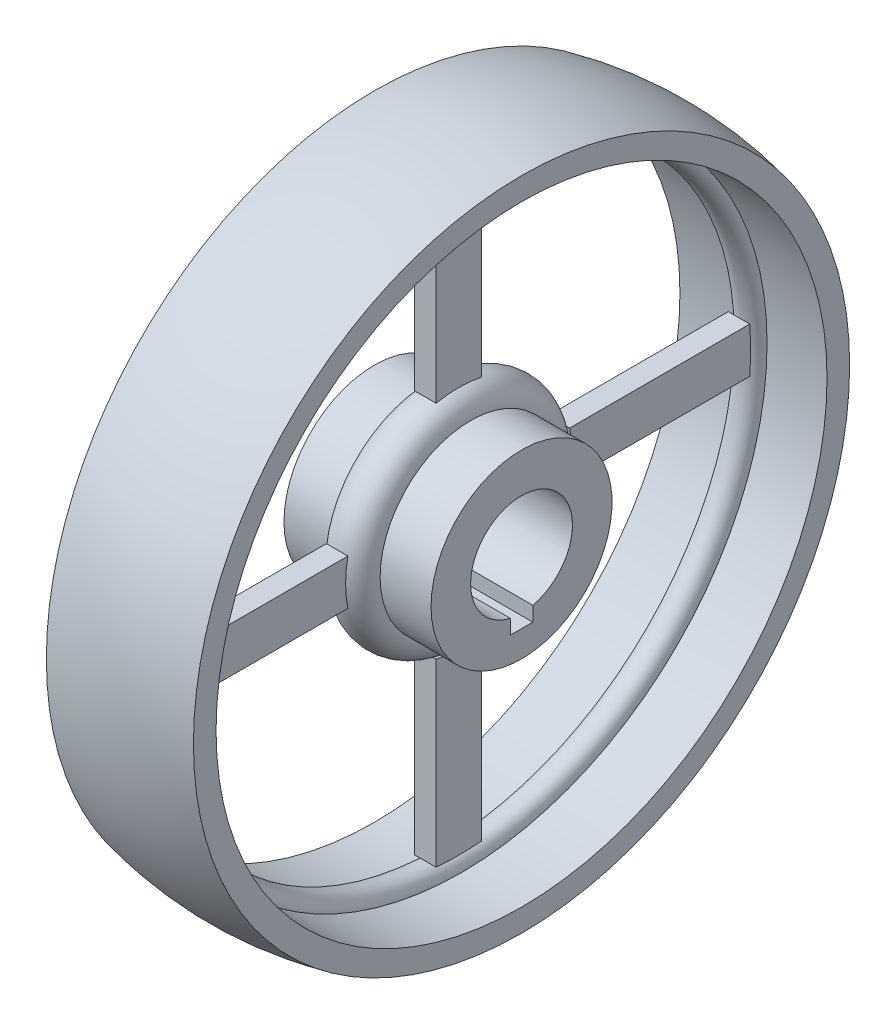
ISO-10303-21;
HEADER;
FILE_DESCRIPTION(('STEP AP214'),'2;1');
FILE_NAME('part.step','',(''),(''),'','','');
FILE_SCHEMA(('AUTOMOTIVE_DESIGN { 1 0 10303 214 1 1 1 1 }'));
ENDSEC;
DATA;
#1=APPLICATION_CONTEXT('core data for automotive mechanical design processes');
#2=APPLICATION_PROTOCOL_DEFINITION('international standard','automotive_design',2000,#1);
#3=PRODUCT_CONTEXT('',#1,'mechanical');
#4=PRODUCT('Part','Part','',(#3));
#5=PRODUCT_RELATED_PRODUCT_CATEGORY('part','',(#4));
#6=PRODUCT_DEFINITION_FORMATION('','',#4);
#7=PRODUCT_DEFINITION_CONTEXT('part definition',#1,'design');
#8=PRODUCT_DEFINITION('design','',#6,#7);
#9=PRODUCT_DEFINITION_SHAPE('','',#8);
#10=(LENGTH_UNIT() NAMED_UNIT(*) SI_UNIT(.MILLI.,.METRE.));
#11=(NAMED_UNIT(*) PLANE_ANGLE_UNIT() SI_UNIT($,.RADIAN.));
#12=(NAMED_UNIT(*) SI_UNIT($,.STERADIAN.) SOLID_ANGLE_UNIT());
#13=UNCERTAINTY_MEASURE_WITH_UNIT(LENGTH_MEASURE(1.E-05),#10,'distance_accuracy_value','');
#14=(GEOMETRIC_REPRESENTATION_CONTEXT(3) GLOBAL_UNCERTAINTY_ASSIGNED_CONTEXT((#13)) GLOBAL_UNIT_ASSIGNED_CONTEXT((#10,
#11,#12)) REPRESENTATION_CONTEXT('',''));
#15=CARTESIAN_POINT('',(0.,0.,0.));
#16=DIRECTION('',(0.,0.,1.));
#17=DIRECTION('',(1.,0.,0.));
#18=AXIS2_PLACEMENT_3D('',#15,#16,#17);
#19=CARTESIAN_POINT('',(4.75,0.,0.));
#20=DIRECTION('',(1.,0.,0.));
#21=DIRECTION('',(0.,0.,-1.));
#22=AXIS2_PLACEMENT_3D('',#19,#20,#21);
#23=PLANE('',#22);
#24=CARTESIAN_POINT('',(4.75,0.,0.));
#25=DIRECTION('',(1.,0.,0.));
#26=DIRECTION('',(0.,0.,-1.));
#27=AXIS2_PLACEMENT_3D('',#24,#25,#26);
#28=CIRCLE('',#27,129.);
#29=CARTESIAN_POINT('',(4.75,128.611819052527,-9.99999999999883));
#30=VERTEX_POINT('',#29);
#31=CARTESIAN_POINT('',(4.75,128.611819052527,10.0000000000012));
#32=VERTEX_POINT('',#31);
#33=EDGE_CURVE('E121',#30,#32,#28,.T.);
#34=ORIENTED_EDGE('',*,*,#33,.T.);
#35=DIRECTION('',(0.,-1.,0.));
#36=VECTOR('',#35,1.);
#37=CARTESIAN_POINT('',(4.75,-1.46844247505873E-13,9.99999999999928));
#38=LINE('',#37,#36);
#39=CARTESIAN_POINT('',(4.75,48.9897948556636,10.));
#40=VERTEX_POINT('',#39);
#41=EDGE_CURVE('E72',#32,#40,#38,.T.);
#42=ORIENTED_EDGE('',*,*,#41,.T.);
#43=CARTESIAN_POINT('',(4.75,0.,0.));
#44=DIRECTION('',(1.,0.,0.));
#45=DIRECTION('',(0.,0.,-1.));
#46=AXIS2_PLACEMENT_3D('',#43,#44,#45);
#47=CIRCLE('',#46,50.);
#48=CARTESIAN_POINT('',(4.75,48.9897948556636,-10.));
#49=VERTEX_POINT('',#48);
#50=EDGE_CURVE('E57',#49,#40,#47,.T.);
#51=ORIENTED_EDGE('',*,*,#50,.F.);
#52=DIRECTION('',(0.,-1.,0.));
#53=VECTOR('',#52,1.);
#54=CARTESIAN_POINT('',(4.75,1.47062117309315E-13,-10.0000000000007));
#55=LINE('',#54,#53);
#56=EDGE_CURVE('E96',#30,#49,#55,.T.);
#57=ORIENTED_EDGE('',*,*,#56,.F.);
#58=EDGE_LOOP('',(#34,#42,#51,#57));
#59=FACE_BOUND('',#58,.T.);
#60=ADVANCED_FACE('F54',(#59),#23,.T.);
#61=CARTESIAN_POINT('',(-4.75,0.,0.));
#62=DIRECTION('',(1.,0.,0.));
#63=DIRECTION('',(0.,0.,-1.));
#64=AXIS2_PLACEMENT_3D('',#61,#62,#63);
#65=PLANE('',#64);
#66=DIRECTION('',(0.,-1.,0.));
#67=VECTOR('',#66,1.);
#68=CARTESIAN_POINT('',(-4.75,-1.46844247505873E-13,9.99999999999928));
#69=LINE('',#68,#67);
#70=CARTESIAN_POINT('',(-4.75,128.611819052527,10.0000000000012));
#71=VERTEX_POINT('',#70);
#72=CARTESIAN_POINT('',(-4.75,48.9897948556636,10.));
#73=VERTEX_POINT('',#72);
#74=EDGE_CURVE('E13',#71,#73,#69,.T.);
#75=ORIENTED_EDGE('',*,*,#74,.F.);
#76=CARTESIAN_POINT('',(-4.75,0.,0.));
#77=DIRECTION('',(1.,0.,0.));
#78=DIRECTION('',(0.,0.,-1.));
#79=AXIS2_PLACEMENT_3D('',#76,#77,#78);
#80=CIRCLE('',#79,129.);
#81=CARTESIAN_POINT('',(-4.75,128.611819052527,-9.99999999999883));
#82=VERTEX_POINT('',#81);
#83=EDGE_CURVE('E113',#82,#71,#80,.T.);
#84=ORIENTED_EDGE('',*,*,#83,.F.);
#85=DIRECTION('',(0.,-1.,0.));
#86=VECTOR('',#85,1.);
#87=CARTESIAN_POINT('',(-4.75,1.47062117309315E-13,-10.0000000000007));
#88=LINE('',#87,#86);
#89=CARTESIAN_POINT('',(-4.75,48.9897948556636,-10.));
#90=VERTEX_POINT('',#89);
#91=EDGE_CURVE('E88',#82,#90,#88,.T.);
#92=ORIENTED_EDGE('',*,*,#91,.T.);
#93=CARTESIAN_POINT('',(-4.75,0.,0.));
#94=DIRECTION('',(1.,0.,0.));
#95=DIRECTION('',(0.,0.,-1.));
#96=AXIS2_PLACEMENT_3D('',#93,#94,#95);
#97=CIRCLE('',#96,50.);
#98=EDGE_CURVE('E111',#90,#73,#97,.T.);
#99=ORIENTED_EDGE('',*,*,#98,.T.);
#100=EDGE_LOOP('',(#75,#84,#92,#99));
#101=FACE_BOUND('',#100,.T.);
#102=ADVANCED_FACE('F126',(#101),#65,.F.);
#103=CARTESIAN_POINT('',(4.75,0.,0.));
#104=DIRECTION('',(-1.,0.,0.));
#105=DIRECTION('',(0.,0.,1.));
#106=AXIS2_PLACEMENT_3D('',#103,#104,#105);
#107=CYLINDRICAL_SURFACE('',#106,129.);
#108=DIRECTION('',(-1.,0.,0.));
#109=VECTOR('',#108,1.);
#110=CARTESIAN_POINT('',(164.75,128.611819052527,10.0000000000012));
#111=LINE('',#110,#109);
#112=EDGE_CURVE('E63',#32,#71,#111,.T.);
#113=ORIENTED_EDGE('',*,*,#112,.F.);
#114=ORIENTED_EDGE('',*,*,#33,.F.);
#115=DIRECTION('',(-1.,0.,0.));
#116=VECTOR('',#115,1.);
#117=CARTESIAN_POINT('',(164.75,128.611819052527,-9.99999999999883));
#118=LINE('',#117,#116);
#119=EDGE_CURVE('E91',#30,#82,#118,.T.);
#120=ORIENTED_EDGE('',*,*,#119,.T.);
#121=ORIENTED_EDGE('',*,*,#83,.T.);
#122=EDGE_LOOP('',(#113,#114,#120,#121));
#123=FACE_BOUND('',#122,.T.);
#124=ADVANCED_FACE('F128',(#123),#107,.T.);
#125=CARTESIAN_POINT('',(4.75,0.,0.));
#126=DIRECTION('',(-1.,0.,0.));
#127=DIRECTION('',(0.,0.,1.));
#128=AXIS2_PLACEMENT_3D('',#125,#126,#127);
#129=CYLINDRICAL_SURFACE('',#128,50.);
#130=ORIENTED_EDGE('',*,*,#50,.T.);
#131=DIRECTION('',(-1.,0.,0.));
#132=VECTOR('',#131,1.);
#133=CARTESIAN_POINT('',(4.75,48.9897948556636,10.));
#134=LINE('',#133,#132);
#135=EDGE_CURVE('E104',#40,#73,#134,.T.);
#136=ORIENTED_EDGE('',*,*,#135,.T.);
#137=ORIENTED_EDGE('',*,*,#98,.F.);
#138=DIRECTION('',(-1.,0.,0.));
#139=VECTOR('',#138,1.);
#140=CARTESIAN_POINT('',(4.75,48.9897948556636,-10.));
#141=LINE('',#140,#139);
#142=EDGE_CURVE('E99',#49,#90,#141,.T.);
#143=ORIENTED_EDGE('',*,*,#142,.F.);
#144=EDGE_LOOP('',(#130,#136,#137,#143));
#145=FACE_BOUND('',#144,.T.);
#146=ADVANCED_FACE('F109',(#145),#129,.F.);
#147=CARTESIAN_POINT('',(164.75,48.9897948556636,-10.));
#148=DIRECTION('',(0.,0.,1.));
#149=DIRECTION('',(0.,-1.,0.));
#150=AXIS2_PLACEMENT_3D('',#147,#148,#149);
#151=PLANE('',#150);
#152=ORIENTED_EDGE('',*,*,#56,.T.);
#153=ORIENTED_EDGE('',*,*,#142,.T.);
#154=ORIENTED_EDGE('',*,*,#91,.F.);
#155=ORIENTED_EDGE('',*,*,#119,.F.);
#156=EDGE_LOOP('',(#152,#153,#154,#155));
#157=FACE_BOUND('',#156,.T.);
#158=ADVANCED_FACE('F98',(#157),#151,.F.);
#159=CARTESIAN_POINT('',(164.75,48.9897948556636,10.));
#160=DIRECTION('',(0.,0.,1.));
#161=DIRECTION('',(0.,-1.,0.));
#162=AXIS2_PLACEMENT_3D('',#159,#160,#161);
#163=PLANE('',#162);
#164=ORIENTED_EDGE('',*,*,#112,.T.);
#165=ORIENTED_EDGE('',*,*,#74,.T.);
#166=ORIENTED_EDGE('',*,*,#135,.F.);
#167=ORIENTED_EDGE('',*,*,#41,.F.);
#168=EDGE_LOOP('',(#164,#165,#166,#167));
#169=FACE_BOUND('',#168,.T.);
#170=ADVANCED_FACE('F137',(#169),#163,.T.);
#171=CLOSED_SHELL('',(#60,#102,#124,#146,#158,#170));
#172=MANIFOLD_SOLID_BREP('B2',#171);
#173=CARTESIAN_POINT('',(4.75,0.,0.));
#174=DIRECTION('',(-1.,0.,0.));
#175=DIRECTION('',(0.,0.,1.));
#176=AXIS2_PLACEMENT_3D('',#173,#174,#175);
#177=CYLINDRICAL_SURFACE('',#176,50.);
#178=CARTESIAN_POINT('',(4.75,0.,0.));
#179=DIRECTION('',(1.,0.,0.));
#180=DIRECTION('',(0.,0.,-1.));
#181=AXIS2_PLACEMENT_3D('',#178,#179,#180);
#182=CIRCLE('',#181,50.);
#183=CARTESIAN_POINT('',(4.75,-48.9897948556637,9.99999999999936));
#184=VERTEX_POINT('',#183);
#185=CARTESIAN_POINT('',(4.75,-48.9897948556652,-10.0000000000006));
#186=VERTEX_POINT('',#185);
#187=EDGE_CURVE('E203',#184,#186,#182,.T.);
#188=ORIENTED_EDGE('',*,*,#187,.T.);
#189=DIRECTION('',(-1.,0.,0.));
#190=VECTOR('',#189,1.);
#191=CARTESIAN_POINT('',(4.75,-48.9897948556634,-10.0000000000006));
#192=LINE('',#191,#190);
#193=CARTESIAN_POINT('',(-4.75,-48.9897948556634,-10.0000000000006));
#194=VERTEX_POINT('',#193);
#195=EDGE_CURVE('E257',#186,#194,#192,.T.);
#196=ORIENTED_EDGE('',*,*,#195,.T.);
#197=CARTESIAN_POINT('',(-4.75,0.,0.));
#198=DIRECTION('',(1.,0.,0.));
#199=DIRECTION('',(0.,0.,-1.));
#200=AXIS2_PLACEMENT_3D('',#197,#198,#199);
#201=CIRCLE('',#200,50.);
#202=CARTESIAN_POINT('',(-4.75,-48.9897948556652,9.99999999999936));
#203=VERTEX_POINT('',#202);
#204=EDGE_CURVE('E255',#203,#194,#201,.T.);
#205=ORIENTED_EDGE('',*,*,#204,.F.);
#206=DIRECTION('',(-1.,0.,0.));
#207=VECTOR('',#206,1.);
#208=CARTESIAN_POINT('',(4.75,-48.9897948556637,9.99999999999936));
#209=LINE('',#208,#207);
#210=EDGE_CURVE('E245',#184,#203,#209,.T.);
#211=ORIENTED_EDGE('',*,*,#210,.F.);
#212=EDGE_LOOP('',(#188,#196,#205,#211));
#213=FACE_BOUND('',#212,.T.);
#214=ADVANCED_FACE('F199',(#213),#177,.F.);
#215=CARTESIAN_POINT('',(4.75,0.,0.));
#216=DIRECTION('',(-1.,0.,0.));
#217=DIRECTION('',(0.,0.,1.));
#218=AXIS2_PLACEMENT_3D('',#215,#216,#217);
#219=CYLINDRICAL_SURFACE('',#218,129.);
#220=DIRECTION('',(-1.,0.,0.));
#221=VECTOR('',#220,1.);
#222=CARTESIAN_POINT('',(164.75,-128.611819052527,-10.0000000000011));
#223=LINE('',#222,#221);
#224=CARTESIAN_POINT('',(4.75,-128.611819052527,-10.0000000000011));
#225=VERTEX_POINT('',#224);
#226=CARTESIAN_POINT('',(-4.75,-128.611819052527,-10.0000000000011));
#227=VERTEX_POINT('',#226);
#228=EDGE_CURVE('E209',#225,#227,#223,.T.);
#229=ORIENTED_EDGE('',*,*,#228,.F.);
#230=CARTESIAN_POINT('',(4.75,0.,0.));
#231=DIRECTION('',(1.,0.,0.));
#232=DIRECTION('',(0.,0.,-1.));
#233=AXIS2_PLACEMENT_3D('',#230,#231,#232);
#234=CIRCLE('',#233,129.);
#235=CARTESIAN_POINT('',(4.75,-128.611819052527,9.99999999999887));
#236=VERTEX_POINT('',#235);
#237=EDGE_CURVE('E262',#236,#225,#234,.T.);
#238=ORIENTED_EDGE('',*,*,#237,.F.);
#239=DIRECTION('',(-1.,0.,0.));
#240=VECTOR('',#239,1.);
#241=CARTESIAN_POINT('',(164.75,-128.611819052527,9.99999999999887));
#242=LINE('',#241,#240);
#243=CARTESIAN_POINT('',(-4.75,-128.611819052527,9.99999999999887));
#244=VERTEX_POINT('',#243);
#245=EDGE_CURVE('E237',#236,#244,#242,.T.);
#246=ORIENTED_EDGE('',*,*,#245,.T.);
#247=CARTESIAN_POINT('',(-4.75,0.,0.));
#248=DIRECTION('',(1.,0.,0.));
#249=DIRECTION('',(0.,0.,-1.));
#250=AXIS2_PLACEMENT_3D('',#247,#248,#249);
#251=CIRCLE('',#250,129.);
#252=EDGE_CURVE('E259',#244,#227,#251,.T.);
#253=ORIENTED_EDGE('',*,*,#252,.T.);
#254=EDGE_LOOP('',(#229,#238,#246,#253));
#255=FACE_BOUND('',#254,.T.);
#256=ADVANCED_FACE('F270',(#255),#219,.T.);
#257=CARTESIAN_POINT('',(-4.75,0.,0.));
#258=DIRECTION('',(1.,0.,0.));
#259=DIRECTION('',(0.,0.,-1.));
#260=AXIS2_PLACEMENT_3D('',#257,#258,#259);
#261=PLANE('',#260);
#262=DIRECTION('',(0.,1.,0.));
#263=VECTOR('',#262,1.);
#264=CARTESIAN_POINT('',(-4.75,0.,-10.0000000000003));
#265=LINE('',#264,#263);
#266=EDGE_CURVE('E52',#227,#194,#265,.T.);
#267=ORIENTED_EDGE('',*,*,#266,.F.);
#268=ORIENTED_EDGE('',*,*,#252,.F.);
#269=DIRECTION('',(0.,1.,0.));
#270=VECTOR('',#269,1.);
#271=CARTESIAN_POINT('',(-4.75,0.,9.99999999999969));
#272=LINE('',#271,#270);
#273=EDGE_CURVE('E234',#244,#203,#272,.T.);
#274=ORIENTED_EDGE('',*,*,#273,.T.);
#275=ORIENTED_EDGE('',*,*,#204,.T.);
#276=EDGE_LOOP('',(#267,#268,#274,#275));
#277=FACE_BOUND('',#276,.T.);
#278=ADVANCED_FACE('F272',(#277),#261,.F.);
#279=CARTESIAN_POINT('',(4.75,0.,0.));
#280=DIRECTION('',(1.,0.,0.));
#281=DIRECTION('',(0.,0.,-1.));
#282=AXIS2_PLACEMENT_3D('',#279,#280,#281);
#283=PLANE('',#282);
#284=ORIENTED_EDGE('',*,*,#237,.T.);
#285=DIRECTION('',(0.,1.,0.));
#286=VECTOR('',#285,1.);
#287=CARTESIAN_POINT('',(4.75,0.,-10.0000000000003));
#288=LINE('',#287,#286);
#289=EDGE_CURVE('E218',#225,#186,#288,.T.);
#290=ORIENTED_EDGE('',*,*,#289,.T.);
#291=ORIENTED_EDGE('',*,*,#187,.F.);
#292=DIRECTION('',(0.,1.,0.));
#293=VECTOR('',#292,1.);
#294=CARTESIAN_POINT('',(4.75,0.,9.99999999999969));
#295=LINE('',#294,#293);
#296=EDGE_CURVE('E242',#236,#184,#295,.T.);
#297=ORIENTED_EDGE('',*,*,#296,.F.);
#298=EDGE_LOOP('',(#284,#290,#291,#297));
#299=FACE_BOUND('',#298,.T.);
#300=ADVANCED_FACE('F201',(#299),#283,.T.);
#301=CARTESIAN_POINT('',(164.75,-48.9897948556652,9.99999999999936));
#302=DIRECTION('',(0.,0.,-1.));
#303=DIRECTION('',(0.,1.,0.));
#304=AXIS2_PLACEMENT_3D('',#301,#302,#303);
#305=PLANE('',#304);
#306=ORIENTED_EDGE('',*,*,#296,.T.);
#307=ORIENTED_EDGE('',*,*,#210,.T.);
#308=ORIENTED_EDGE('',*,*,#273,.F.);
#309=ORIENTED_EDGE('',*,*,#245,.F.);
#310=EDGE_LOOP('',(#306,#307,#308,#309));
#311=FACE_BOUND('',#310,.T.);
#312=ADVANCED_FACE('F244',(#311),#305,.F.);
#313=CARTESIAN_POINT('',(164.75,-48.9897948556652,-10.0000000000006));
#314=DIRECTION('',(0.,0.,-1.));
#315=DIRECTION('',(0.,1.,0.));
#316=AXIS2_PLACEMENT_3D('',#313,#314,#315);
#317=PLANE('',#316);
#318=ORIENTED_EDGE('',*,*,#228,.T.);
#319=ORIENTED_EDGE('',*,*,#266,.T.);
#320=ORIENTED_EDGE('',*,*,#195,.F.);
#321=ORIENTED_EDGE('',*,*,#289,.F.);
#322=EDGE_LOOP('',(#318,#319,#320,#321));
#323=FACE_BOUND('',#322,.T.);
#324=ADVANCED_FACE('F284',(#323),#317,.T.);
#325=CLOSED_SHELL('',(#214,#256,#278,#300,#312,#324));
#326=MANIFOLD_SOLID_BREP('B7',#325);
#327=CARTESIAN_POINT('',(4.75,0.,0.));
#328=DIRECTION('',(-1.,0.,0.));
#329=DIRECTION('',(0.,0.,1.));
#330=AXIS2_PLACEMENT_3D('',#327,#328,#329);
#331=CYLINDRICAL_SURFACE('',#330,50.);
#332=DIRECTION('',(-1.,0.,0.));
#333=VECTOR('',#332,1.);
#334=CARTESIAN_POINT('',(4.75,10.0000000000005,48.9897948556635));
#335=LINE('',#334,#333);
#336=CARTESIAN_POINT('',(4.75,10.0000000000005,48.9897948556635));
#337=VERTEX_POINT('',#336);
#338=CARTESIAN_POINT('',(-4.75,10.0000000000005,48.9897948556635));
#339=VERTEX_POINT('',#338);
#340=EDGE_CURVE('E197',#337,#339,#335,.T.);
#341=ORIENTED_EDGE('',*,*,#340,.F.);
#342=CARTESIAN_POINT('',(4.75,0.,0.));
#343=DIRECTION('',(1.,0.,0.));
#344=DIRECTION('',(0.,0.,-1.));
#345=AXIS2_PLACEMENT_3D('',#342,#343,#344);
#346=CIRCLE('',#345,50.);
#347=CARTESIAN_POINT('',(4.75,-9.99999999999949,48.9897948556637));
#348=VERTEX_POINT('',#347);
#349=EDGE_CURVE('E348',#337,#348,#346,.T.);
#350=ORIENTED_EDGE('',*,*,#349,.T.);
#351=DIRECTION('',(-1.,0.,0.));
#352=VECTOR('',#351,1.);
#353=CARTESIAN_POINT('',(4.75,-9.99999999999949,48.9897948556637));
#354=LINE('',#353,#352);
#355=CARTESIAN_POINT('',(-4.75,-9.99999999999949,48.9897948556637));
#356=VERTEX_POINT('',#355);
#357=EDGE_CURVE('E383',#348,#356,#354,.T.);
#358=ORIENTED_EDGE('',*,*,#357,.T.);
#359=CARTESIAN_POINT('',(-4.75,0.,0.));
#360=DIRECTION('',(1.,0.,0.));
#361=DIRECTION('',(0.,0.,-1.));
#362=AXIS2_PLACEMENT_3D('',#359,#360,#361);
#363=CIRCLE('',#362,50.);
#364=EDGE_CURVE('E399',#339,#356,#363,.T.);
#365=ORIENTED_EDGE('',*,*,#364,.F.);
#366=EDGE_LOOP('',(#341,#350,#358,#365));
#367=FACE_BOUND('',#366,.T.);
#368=ADVANCED_FACE('F344',(#367),#331,.F.);
#369=CARTESIAN_POINT('',(4.75,0.,0.));
#370=DIRECTION('',(-1.,0.,0.));
#371=DIRECTION('',(0.,0.,1.));
#372=AXIS2_PLACEMENT_3D('',#369,#370,#371);
#373=CYLINDRICAL_SURFACE('',#372,129.);
#374=CARTESIAN_POINT('',(4.75,0.,0.));
#375=DIRECTION('',(1.,0.,0.));
#376=DIRECTION('',(0.,0.,-1.));
#377=AXIS2_PLACEMENT_3D('',#374,#375,#376);
#378=CIRCLE('',#377,129.);
#379=CARTESIAN_POINT('',(4.75,9.99999999999886,128.611819052527));
#380=VERTEX_POINT('',#379);
#381=CARTESIAN_POINT('',(4.75,-10.0000000000011,128.611819052527));
#382=VERTEX_POINT('',#381);
#383=EDGE_CURVE('E403',#380,#382,#378,.T.);
#384=ORIENTED_EDGE('',*,*,#383,.F.);
#385=DIRECTION('',(-1.,0.,0.));
#386=VECTOR('',#385,1.);
#387=CARTESIAN_POINT('',(164.75,9.99999999999886,128.611819052527));
#388=LINE('',#387,#386);
#389=CARTESIAN_POINT('',(-4.75,9.99999999999886,128.611819052527));
#390=VERTEX_POINT('',#389);
#391=EDGE_CURVE('E363',#380,#390,#388,.T.);
#392=ORIENTED_EDGE('',*,*,#391,.T.);
#393=CARTESIAN_POINT('',(-4.75,0.,0.));
#394=DIRECTION('',(1.,0.,0.));
#395=DIRECTION('',(0.,0.,-1.));
#396=AXIS2_PLACEMENT_3D('',#393,#394,#395);
#397=CIRCLE('',#396,129.);
#398=CARTESIAN_POINT('',(-4.75,-10.0000000000011,128.611819052527));
#399=VERTEX_POINT('',#398);
#400=EDGE_CURVE('E401',#390,#399,#397,.T.);
#401=ORIENTED_EDGE('',*,*,#400,.T.);
#402=DIRECTION('',(-1.,0.,0.));
#403=VECTOR('',#402,1.);
#404=CARTESIAN_POINT('',(164.75,-10.0000000000011,128.611819052527));
#405=LINE('',#404,#403);
#406=EDGE_CURVE('E412',#382,#399,#405,.T.);
#407=ORIENTED_EDGE('',*,*,#406,.F.);
#408=EDGE_LOOP('',(#384,#392,#401,#407));
#409=FACE_BOUND('',#408,.T.);
#410=ADVANCED_FACE('F417',(#409),#373,.T.);
#411=CARTESIAN_POINT('',(-4.75,0.,0.));
#412=DIRECTION('',(1.,0.,0.));
#413=DIRECTION('',(0.,0.,-1.));
#414=AXIS2_PLACEMENT_3D('',#411,#412,#413);
#415=PLANE('',#414);
#416=ORIENTED_EDGE('',*,*,#400,.F.);
#417=DIRECTION('',(0.,0.,-1.));
#418=VECTOR('',#417,1.);
#419=CARTESIAN_POINT('',(-4.75,10.0000000000015,2.07629922660427E-13));
#420=LINE('',#419,#418);
#421=EDGE_CURVE('E390',#390,#339,#420,.T.);
#422=ORIENTED_EDGE('',*,*,#421,.T.);
#423=ORIENTED_EDGE('',*,*,#364,.T.);
#424=DIRECTION('',(0.,0.,-1.));
#425=VECTOR('',#424,1.);
#426=CARTESIAN_POINT('',(-4.75,-9.99999999999847,-2.08065662267207E-13));
#427=LINE('',#426,#425);
#428=EDGE_CURVE('E386',#399,#356,#427,.T.);
#429=ORIENTED_EDGE('',*,*,#428,.F.);
#430=EDGE_LOOP('',(#416,#422,#423,#429));
#431=FACE_BOUND('',#430,.T.);
#432=ADVANCED_FACE('F398',(#431),#415,.F.);
#433=CARTESIAN_POINT('',(4.75,0.,0.));
#434=DIRECTION('',(1.,0.,0.));
#435=DIRECTION('',(0.,0.,-1.));
#436=AXIS2_PLACEMENT_3D('',#433,#434,#435);
#437=PLANE('',#436);
#438=DIRECTION('',(0.,0.,-1.));
#439=VECTOR('',#438,1.);
#440=CARTESIAN_POINT('',(4.75,10.0000000000015,2.07629922660427E-13));
#441=LINE('',#440,#439);
#442=EDGE_CURVE('E354',#380,#337,#441,.T.);
#443=ORIENTED_EDGE('',*,*,#442,.F.);
#444=ORIENTED_EDGE('',*,*,#383,.T.);
#445=DIRECTION('',(0.,0.,-1.));
#446=VECTOR('',#445,1.);
#447=CARTESIAN_POINT('',(4.75,-9.99999999999847,-2.08065662267207E-13));
#448=LINE('',#447,#446);
#449=EDGE_CURVE('E378',#382,#348,#448,.T.);
#450=ORIENTED_EDGE('',*,*,#449,.T.);
#451=ORIENTED_EDGE('',*,*,#349,.F.);
#452=EDGE_LOOP('',(#443,#444,#450,#451));
#453=FACE_BOUND('',#452,.T.);
#454=ADVANCED_FACE('F346',(#453),#437,.T.);
#455=CARTESIAN_POINT('',(164.75,-9.99999999999949,48.9897948556637));
#456=DIRECTION('',(0.,-1.,0.));
#457=DIRECTION('',(0.,0.,-1.));
#458=AXIS2_PLACEMENT_3D('',#455,#456,#457);
#459=PLANE('',#458);
#460=ORIENTED_EDGE('',*,*,#406,.T.);
#461=ORIENTED_EDGE('',*,*,#428,.T.);
#462=ORIENTED_EDGE('',*,*,#357,.F.);
#463=ORIENTED_EDGE('',*,*,#449,.F.);
#464=EDGE_LOOP('',(#460,#461,#462,#463));
#465=FACE_BOUND('',#464,.T.);
#466=ADVANCED_FACE('F418',(#465),#459,.T.);
#467=CARTESIAN_POINT('',(164.75,10.0000000000005,48.9897948556635));
#468=DIRECTION('',(0.,-1.,0.));
#469=DIRECTION('',(0.,0.,-1.));
#470=AXIS2_PLACEMENT_3D('',#467,#468,#469);
#471=PLANE('',#470);
#472=ORIENTED_EDGE('',*,*,#442,.T.);
#473=ORIENTED_EDGE('',*,*,#340,.T.);
#474=ORIENTED_EDGE('',*,*,#421,.F.);
#475=ORIENTED_EDGE('',*,*,#391,.F.);
#476=EDGE_LOOP('',(#472,#473,#474,#475));
#477=FACE_BOUND('',#476,.T.);
#478=ADVANCED_FACE('F389',(#477),#471,.F.);
#479=CLOSED_SHELL('',(#368,#410,#432,#454,#466,#478));
#480=MANIFOLD_SOLID_BREP('B46',#479);
#481=CARTESIAN_POINT('',(4.75,0.,0.));
#482=DIRECTION('',(-1.,0.,0.));
#483=DIRECTION('',(0.,0.,1.));
#484=AXIS2_PLACEMENT_3D('',#481,#482,#483);
#485=CYLINDRICAL_SURFACE('',#484,50.);
#486=CARTESIAN_POINT('',(4.75,0.,0.));
#487=DIRECTION('',(1.,0.,0.));
#488=DIRECTION('',(0.,0.,-1.));
#489=AXIS2_PLACEMENT_3D('',#486,#487,#488);
#490=CIRCLE('',#489,50.);
#491=CARTESIAN_POINT('',(4.75,-10.0000000000002,-48.9897948556635));
#492=VERTEX_POINT('',#491);
#493=CARTESIAN_POINT('',(4.75,9.99999999999983,-48.9897948556636));
#494=VERTEX_POINT('',#493);
#495=EDGE_CURVE('E544',#492,#494,#490,.T.);
#496=ORIENTED_EDGE('',*,*,#495,.T.);
#497=DIRECTION('',(-1.,0.,0.));
#498=VECTOR('',#497,1.);
#499=CARTESIAN_POINT('',(4.75,9.99999999999983,-48.9897948556636));
#500=LINE('',#499,#498);
#501=CARTESIAN_POINT('',(-4.75,9.99999999999983,-48.9897948556636));
#502=VERTEX_POINT('',#501);
#503=EDGE_CURVE('E342',#494,#502,#500,.T.);
#504=ORIENTED_EDGE('',*,*,#503,.T.);
#505=CARTESIAN_POINT('',(-4.75,0.,0.));
#506=DIRECTION('',(1.,0.,0.));
#507=DIRECTION('',(0.,0.,-1.));
#508=AXIS2_PLACEMENT_3D('',#505,#506,#507);
#509=CIRCLE('',#508,50.);
#510=CARTESIAN_POINT('',(-4.75,-10.0000000000002,-48.9897948556635));
#511=VERTEX_POINT('',#510);
#512=EDGE_CURVE('E551',#511,#502,#509,.T.);
#513=ORIENTED_EDGE('',*,*,#512,.F.);
#514=DIRECTION('',(-1.,0.,0.));
#515=VECTOR('',#514,1.);
#516=CARTESIAN_POINT('',(4.75,-10.0000000000002,-48.9897948556635));
#517=LINE('',#516,#515);
#518=EDGE_CURVE('E497',#492,#511,#517,.T.);
#519=ORIENTED_EDGE('',*,*,#518,.F.);
#520=EDGE_LOOP('',(#496,#504,#513,#519));
#521=FACE_BOUND('',#520,.T.);
#522=ADVANCED_FACE('F489',(#521),#485,.F.);
#523=CARTESIAN_POINT('',(4.75,0.,0.));
#524=DIRECTION('',(-1.,0.,0.));
#525=DIRECTION('',(0.,0.,1.));
#526=AXIS2_PLACEMENT_3D('',#523,#524,#525);
#527=CYLINDRICAL_SURFACE('',#526,129.);
#528=DIRECTION('',(-1.,0.,0.));
#529=VECTOR('',#528,1.);
#530=CARTESIAN_POINT('',(164.75,10.0000000000012,-128.611819052527));
#531=LINE('',#530,#529);
#532=CARTESIAN_POINT('',(4.75,10.0000000000012,-128.611819052527));
#533=VERTEX_POINT('',#532);
#534=CARTESIAN_POINT('',(-4.75,10.0000000000012,-128.611819052527));
#535=VERTEX_POINT('',#534);
#536=EDGE_CURVE('E535',#533,#535,#531,.T.);
#537=ORIENTED_EDGE('',*,*,#536,.F.);
#538=CARTESIAN_POINT('',(4.75,0.,0.));
#539=DIRECTION('',(1.,0.,0.));
#540=DIRECTION('',(0.,0.,-1.));
#541=AXIS2_PLACEMENT_3D('',#538,#539,#540);
#542=CIRCLE('',#541,129.);
#543=CARTESIAN_POINT('',(4.75,-9.99999999999882,-128.611819052527));
#544=VERTEX_POINT('',#543);
#545=EDGE_CURVE('E542',#544,#533,#542,.T.);
#546=ORIENTED_EDGE('',*,*,#545,.F.);
#547=DIRECTION('',(-1.,0.,0.));
#548=VECTOR('',#547,1.);
#549=CARTESIAN_POINT('',(164.75,-9.99999999999882,-128.611819052527));
#550=LINE('',#549,#548);
#551=CARTESIAN_POINT('',(-4.75,-9.99999999999882,-128.611819052527));
#552=VERTEX_POINT('',#551);
#553=EDGE_CURVE('E527',#544,#552,#550,.T.);
#554=ORIENTED_EDGE('',*,*,#553,.T.);
#555=CARTESIAN_POINT('',(-4.75,0.,0.));
#556=DIRECTION('',(1.,0.,0.));
#557=DIRECTION('',(0.,0.,-1.));
#558=AXIS2_PLACEMENT_3D('',#555,#556,#557);
#559=CIRCLE('',#558,129.);
#560=EDGE_CURVE('E547',#552,#535,#559,.T.);
#561=ORIENTED_EDGE('',*,*,#560,.T.);
#562=EDGE_LOOP('',(#537,#546,#554,#561));
#563=FACE_BOUND('',#562,.T.);
#564=ADVANCED_FACE('F491',(#563),#527,.T.);
#565=CARTESIAN_POINT('',(-4.75,0.,0.));
#566=DIRECTION('',(1.,0.,0.));
#567=DIRECTION('',(0.,0.,-1.));
#568=AXIS2_PLACEMENT_3D('',#565,#566,#567);
#569=PLANE('',#568);
#570=DIRECTION('',(0.,0.,1.));
#571=VECTOR('',#570,1.);
#572=CARTESIAN_POINT('',(-4.75,9.999999999999,1.69066967454828E-13));
#573=LINE('',#572,#571);
#574=EDGE_CURVE('E504',#535,#502,#573,.T.);
#575=ORIENTED_EDGE('',*,*,#574,.F.);
#576=ORIENTED_EDGE('',*,*,#560,.F.);
#577=DIRECTION('',(0.,0.,1.));
#578=VECTOR('',#577,1.);
#579=CARTESIAN_POINT('',(-4.75,-10.000000000001,-1.69502707061704E-13));
#580=LINE('',#579,#578);
#581=EDGE_CURVE('E530',#552,#511,#580,.T.);
#582=ORIENTED_EDGE('',*,*,#581,.T.);
#583=ORIENTED_EDGE('',*,*,#512,.T.);
#584=EDGE_LOOP('',(#575,#576,#582,#583));
#585=FACE_BOUND('',#584,.T.);
#586=ADVANCED_FACE('F561',(#585),#569,.F.);
#587=CARTESIAN_POINT('',(4.75,0.,0.));
#588=DIRECTION('',(1.,0.,0.));
#589=DIRECTION('',(0.,0.,-1.));
#590=AXIS2_PLACEMENT_3D('',#587,#588,#589);
#591=PLANE('',#590);
#592=ORIENTED_EDGE('',*,*,#545,.T.);
#593=DIRECTION('',(0.,0.,1.));
#594=VECTOR('',#593,1.);
#595=CARTESIAN_POINT('',(4.75,9.999999999999,1.69066967454828E-13));
#596=LINE('',#595,#594);
#597=EDGE_CURVE('E554',#533,#494,#596,.T.);
#598=ORIENTED_EDGE('',*,*,#597,.T.);
#599=ORIENTED_EDGE('',*,*,#495,.F.);
#600=DIRECTION('',(0.,0.,1.));
#601=VECTOR('',#600,1.);
#602=CARTESIAN_POINT('',(4.75,-10.000000000001,-1.69502707061704E-13));
#603=LINE('',#602,#601);
#604=EDGE_CURVE('E511',#544,#492,#603,.T.);
#605=ORIENTED_EDGE('',*,*,#604,.F.);
#606=EDGE_LOOP('',(#592,#598,#599,#605));
#607=FACE_BOUND('',#606,.T.);
#608=ADVANCED_FACE('F540',(#607),#591,.T.);
#609=CARTESIAN_POINT('',(164.75,-10.0000000000002,-48.9897948556635));
#610=DIRECTION('',(0.,1.,0.));
#611=DIRECTION('',(0.,0.,1.));
#612=AXIS2_PLACEMENT_3D('',#609,#610,#611);
#613=PLANE('',#612);
#614=ORIENTED_EDGE('',*,*,#604,.T.);
#615=ORIENTED_EDGE('',*,*,#518,.T.);
#616=ORIENTED_EDGE('',*,*,#581,.F.);
#617=ORIENTED_EDGE('',*,*,#553,.F.);
#618=EDGE_LOOP('',(#614,#615,#616,#617));
#619=FACE_BOUND('',#618,.T.);
#620=ADVANCED_FACE('F528',(#619),#613,.F.);
#621=CARTESIAN_POINT('',(164.75,9.99999999999983,-48.9897948556636));
#622=DIRECTION('',(0.,1.,0.));
#623=DIRECTION('',(0.,0.,1.));
#624=AXIS2_PLACEMENT_3D('',#621,#622,#623);
#625=PLANE('',#624);
#626=ORIENTED_EDGE('',*,*,#536,.T.);
#627=ORIENTED_EDGE('',*,*,#574,.T.);
#628=ORIENTED_EDGE('',*,*,#503,.F.);
#629=ORIENTED_EDGE('',*,*,#597,.F.);
#630=EDGE_LOOP('',(#626,#627,#628,#629));
#631=FACE_BOUND('',#630,.T.);
#632=ADVANCED_FACE('F559',(#631),#625,.T.);
#633=CLOSED_SHELL('',(#522,#564,#586,#608,#620,#632));
#634=MANIFOLD_SOLID_BREP('B191',#633);
#635=CARTESIAN_POINT('',(0.,0.,0.));
#636=DIRECTION('',(-1.,0.,0.));
#637=DIRECTION('',(0.,0.,1.));
#638=AXIS2_PLACEMENT_3D('',#635,#636,#637);
#639=TOROIDAL_SURFACE('',#638,40.,10.);
#640=CARTESIAN_POINT('',(-10.,0.,0.));
#641=DIRECTION('',(-1.,0.,0.));
#642=DIRECTION('',(0.,0.,1.));
#643=AXIS2_PLACEMENT_3D('',#640,#641,#642);
#644=CIRCLE('',#643,40.);
#645=CARTESIAN_POINT('',(-10.,0.,40.));
#646=VERTEX_POINT('',#645);
#647=EDGE_CURVE('E712',#646,#646,#644,.T.);
#648=ORIENTED_EDGE('',*,*,#647,.F.);
#649=EDGE_LOOP('',(#648));
#650=FACE_BOUND('',#649,.T.);
#651=CARTESIAN_POINT('',(9.99999999999999,0.,0.));
#652=DIRECTION('',(-1.,0.,0.));
#653=DIRECTION('',(0.,0.,1.));
#654=AXIS2_PLACEMENT_3D('',#651,#652,#653);
#655=CIRCLE('',#654,40.);
#656=CARTESIAN_POINT('',(9.99999999999999,0.,40.));
#657=VERTEX_POINT('',#656);
#658=EDGE_CURVE('E703',#657,#657,#655,.T.);
#659=ORIENTED_EDGE('',*,*,#658,.T.);
#660=EDGE_LOOP('',(#659));
#661=FACE_BOUND('',#660,.T.);
#662=ADVANCED_FACE('F631',(#650,#661),#639,.T.);
#663=CARTESIAN_POINT('',(-46.335135684214,0.,0.));
#664=DIRECTION('',(-1.,0.,0.));
#665=DIRECTION('',(0.,0.,1.));
#666=AXIS2_PLACEMENT_3D('',#663,#664,#665);
#667=CYLINDRICAL_SURFACE('',#666,40.);
#668=CARTESIAN_POINT('',(-32.5,0.,0.));
#669=DIRECTION('',(-1.,0.,0.));
#670=DIRECTION('',(0.,0.,1.));
#671=AXIS2_PLACEMENT_3D('',#668,#669,#670);
#672=CIRCLE('',#671,40.);
#673=CARTESIAN_POINT('',(-32.5,0.,40.));
#674=VERTEX_POINT('',#673);
#675=EDGE_CURVE('E709',#674,#674,#672,.T.);
#676=ORIENTED_EDGE('',*,*,#675,.F.);
#677=EDGE_LOOP('',(#676));
#678=FACE_BOUND('',#677,.T.);
#679=ORIENTED_EDGE('',*,*,#647,.T.);
#680=EDGE_LOOP('',(#679));
#681=FACE_BOUND('',#680,.T.);
#682=ADVANCED_FACE('F731',(#678,#681),#667,.T.);
#683=CARTESIAN_POINT('',(-32.5,10.,0.));
#684=DIRECTION('',(1.,0.,0.));
#685=DIRECTION('',(0.,0.,-1.));
#686=AXIS2_PLACEMENT_3D('',#683,#684,#685);
#687=PLANE('',#686);
#688=DIRECTION('',(0.,0.,-1.));
#689=VECTOR('',#688,1.);
#690=CARTESIAN_POINT('',(-32.5,-28.3904366064984,0.));
#691=LINE('',#690,#689);
#692=CARTESIAN_POINT('',(-32.5,-28.3904366064984,4.97350714274425));
#693=VERTEX_POINT('',#692);
#694=CARTESIAN_POINT('',(-32.5,-28.3904366064984,-4.97350714274425));
#695=VERTEX_POINT('',#694);
#696=EDGE_CURVE('E677',#693,#695,#691,.T.);
#697=ORIENTED_EDGE('',*,*,#696,.T.);
#698=DIRECTION('',(0.,1.,0.));
#699=VECTOR('',#698,1.);
#700=CARTESIAN_POINT('',(-32.5,10.,-4.97350714274425));
#701=LINE('',#700,#699);
#702=CARTESIAN_POINT('',(-32.5,-21.9434324275185,-4.97350714274425));
#703=VERTEX_POINT('',#702);
#704=EDGE_CURVE('E695',#695,#703,#701,.T.);
#705=ORIENTED_EDGE('',*,*,#704,.T.);
#706=CARTESIAN_POINT('',(-32.5,0.,0.));
#707=DIRECTION('',(1.,0.,0.));
#708=DIRECTION('',(0.,0.,-1.));
#709=AXIS2_PLACEMENT_3D('',#706,#707,#708);
#710=CIRCLE('',#709,22.5);
#711=CARTESIAN_POINT('',(-32.5,-21.9434324275185,4.97350714274425));
#712=VERTEX_POINT('',#711);
#713=EDGE_CURVE('E700',#703,#712,#710,.T.);
#714=ORIENTED_EDGE('',*,*,#713,.T.);
#715=DIRECTION('',(0.,-1.,0.));
#716=VECTOR('',#715,1.);
#717=CARTESIAN_POINT('',(-32.5,10.,4.97350714274425));
#718=LINE('',#717,#716);
#719=EDGE_CURVE('E645',#712,#693,#718,.T.);
#720=ORIENTED_EDGE('',*,*,#719,.T.);
#721=EDGE_LOOP('',(#697,#705,#714,#720));
#722=FACE_BOUND('',#721,.T.);
#723=ORIENTED_EDGE('',*,*,#675,.T.);
#724=EDGE_LOOP('',(#723));
#725=FACE_BOUND('',#724,.T.);
#726=ADVANCED_FACE('F718',(#722,#725),#687,.F.);
#727=CARTESIAN_POINT('',(32.5,10.,0.));
#728=DIRECTION('',(-1.,0.,0.));
#729=DIRECTION('',(0.,0.,1.));
#730=AXIS2_PLACEMENT_3D('',#727,#728,#729);
#731=PLANE('',#730);
#732=CARTESIAN_POINT('',(32.5,0.,0.));
#733=DIRECTION('',(1.,0.,0.));
#734=DIRECTION('',(0.,0.,-1.));
#735=AXIS2_PLACEMENT_3D('',#732,#733,#734);
#736=CIRCLE('',#735,22.5);
#737=CARTESIAN_POINT('',(32.5,-21.9434324275185,-4.97350714274425));
#738=VERTEX_POINT('',#737);
#739=CARTESIAN_POINT('',(32.5,-21.9434324275185,4.97350714274425));
#740=VERTEX_POINT('',#739);
#741=EDGE_CURVE('E698',#738,#740,#736,.T.);
#742=ORIENTED_EDGE('',*,*,#741,.F.);
#743=DIRECTION('',(0.,1.,0.));
#744=VECTOR('',#743,1.);
#745=CARTESIAN_POINT('',(32.5,-16.6095633935016,-4.97350714274425));
#746=LINE('',#745,#744);
#747=CARTESIAN_POINT('',(32.5,-28.3904366064984,-4.97350714274425));
#748=VERTEX_POINT('',#747);
#749=EDGE_CURVE('E686',#748,#738,#746,.T.);
#750=ORIENTED_EDGE('',*,*,#749,.F.);
#751=DIRECTION('',(0.,0.,-1.));
#752=VECTOR('',#751,1.);
#753=CARTESIAN_POINT('',(32.5,-28.3904366064984,4.97350714274425));
#754=LINE('',#753,#752);
#755=CARTESIAN_POINT('',(32.5,-28.3904366064984,4.97350714274425));
#756=VERTEX_POINT('',#755);
#757=EDGE_CURVE('E674',#756,#748,#754,.T.);
#758=ORIENTED_EDGE('',*,*,#757,.F.);
#759=DIRECTION('',(0.,-1.,0.));
#760=VECTOR('',#759,1.);
#761=CARTESIAN_POINT('',(32.5,-16.6095633935016,4.97350714274425));
#762=LINE('',#761,#760);
#763=EDGE_CURVE('E681',#740,#756,#762,.T.);
#764=ORIENTED_EDGE('',*,*,#763,.F.);
#765=EDGE_LOOP('',(#742,#750,#758,#764));
#766=FACE_BOUND('',#765,.T.);
#767=CARTESIAN_POINT('',(32.5,0.,0.));
#768=DIRECTION('',(-1.,0.,0.));
#769=DIRECTION('',(0.,0.,1.));
#770=AXIS2_PLACEMENT_3D('',#767,#768,#769);
#771=CIRCLE('',#770,40.);
#772=CARTESIAN_POINT('',(32.5,0.,40.));
#773=VERTEX_POINT('',#772);
#774=EDGE_CURVE('E706',#773,#773,#771,.T.);
#775=ORIENTED_EDGE('',*,*,#774,.F.);
#776=EDGE_LOOP('',(#775));
#777=FACE_BOUND('',#776,.T.);
#778=ADVANCED_FACE('F688',(#766,#777),#731,.F.);
#779=CARTESIAN_POINT('',(-46.335135684214,0.,0.));
#780=DIRECTION('',(-1.,0.,0.));
#781=DIRECTION('',(0.,0.,1.));
#782=AXIS2_PLACEMENT_3D('',#779,#780,#781);
#783=CYLINDRICAL_SURFACE('',#782,40.);
#784=ORIENTED_EDGE('',*,*,#658,.F.);
#785=EDGE_LOOP('',(#784));
#786=FACE_BOUND('',#785,.T.);
#787=ORIENTED_EDGE('',*,*,#774,.T.);
#788=EDGE_LOOP('',(#787));
#789=FACE_BOUND('',#788,.T.);
#790=ADVANCED_FACE('F741',(#786,#789),#783,.T.);
#791=CARTESIAN_POINT('',(-105.5,0.,0.));
#792=DIRECTION('',(1.,0.,0.));
#793=DIRECTION('',(0.,0.,-1.));
#794=AXIS2_PLACEMENT_3D('',#791,#792,#793);
#795=CYLINDRICAL_SURFACE('',#794,22.5);
#796=ORIENTED_EDGE('',*,*,#713,.F.);
#797=DIRECTION('',(1.,0.,0.));
#798=VECTOR('',#797,1.);
#799=CARTESIAN_POINT('',(-105.5,-21.9434324275185,-4.97350714274425));
#800=LINE('',#799,#798);
#801=EDGE_CURVE('E487',#703,#738,#800,.T.);
#802=ORIENTED_EDGE('',*,*,#801,.T.);
#803=ORIENTED_EDGE('',*,*,#741,.T.);
#804=DIRECTION('',(1.,0.,0.));
#805=VECTOR('',#804,1.);
#806=CARTESIAN_POINT('',(-105.5,-21.9434324275185,4.97350714274425));
#807=LINE('',#806,#805);
#808=EDGE_CURVE('E638',#740,#712,#807,.F.);
#809=ORIENTED_EDGE('',*,*,#808,.T.);
#810=EDGE_LOOP('',(#796,#802,#803,#809));
#811=FACE_BOUND('',#810,.T.);
#812=ADVANCED_FACE('F716',(#811),#795,.F.);
#813=CARTESIAN_POINT('',(-105.5,-28.3904366064984,4.97350714274425));
#814=DIRECTION('',(0.,-1.,0.));
#815=DIRECTION('',(0.,0.,-1.));
#816=AXIS2_PLACEMENT_3D('',#813,#814,#815);
#817=PLANE('',#816);
#818=DIRECTION('',(1.,0.,0.));
#819=VECTOR('',#818,1.);
#820=CARTESIAN_POINT('',(-105.5,-28.3904366064984,4.97350714274425));
#821=LINE('',#820,#819);
#822=EDGE_CURVE('E669',#693,#756,#821,.T.);
#823=ORIENTED_EDGE('',*,*,#822,.T.);
#824=ORIENTED_EDGE('',*,*,#757,.T.);
#825=DIRECTION('',(1.,0.,0.));
#826=VECTOR('',#825,1.);
#827=CARTESIAN_POINT('',(-105.5,-28.3904366064984,-4.97350714274425));
#828=LINE('',#827,#826);
#829=EDGE_CURVE('E678',#695,#748,#828,.T.);
#830=ORIENTED_EDGE('',*,*,#829,.F.);
#831=ORIENTED_EDGE('',*,*,#696,.F.);
#832=EDGE_LOOP('',(#823,#824,#830,#831));
#833=FACE_BOUND('',#832,.T.);
#834=ADVANCED_FACE('F671',(#833),#817,.F.);
#835=CARTESIAN_POINT('',(-105.5,-16.6095633935016,-4.97350714274425));
#836=DIRECTION('',(0.,0.,-1.));
#837=DIRECTION('',(-1.,0.,0.));
#838=AXIS2_PLACEMENT_3D('',#835,#836,#837);
#839=PLANE('',#838);
#840=ORIENTED_EDGE('',*,*,#829,.T.);
#841=ORIENTED_EDGE('',*,*,#749,.T.);
#842=ORIENTED_EDGE('',*,*,#801,.F.);
#843=ORIENTED_EDGE('',*,*,#704,.F.);
#844=EDGE_LOOP('',(#840,#841,#842,#843));
#845=FACE_BOUND('',#844,.T.);
#846=ADVANCED_FACE('F720',(#845),#839,.F.);
#847=CARTESIAN_POINT('',(-105.5,-16.6095633935016,4.97350714274425));
#848=DIRECTION('',(0.,0.,1.));
#849=DIRECTION('',(1.,0.,0.));
#850=AXIS2_PLACEMENT_3D('',#847,#848,#849);
#851=PLANE('',#850);
#852=ORIENTED_EDGE('',*,*,#808,.F.);
#853=ORIENTED_EDGE('',*,*,#763,.T.);
#854=ORIENTED_EDGE('',*,*,#822,.F.);
#855=ORIENTED_EDGE('',*,*,#719,.F.);
#856=EDGE_LOOP('',(#852,#853,#854,#855));
#857=FACE_BOUND('',#856,.T.);
#858=ADVANCED_FACE('F682',(#857),#851,.F.);
#859=CLOSED_SHELL('',(#662,#682,#726,#778,#790,#812,#834,#846,#858));
#860=MANIFOLD_SOLID_BREP('B336',#859);
#861=CARTESIAN_POINT('',(0.,0.,0.));
#862=DIRECTION('',(-1.,0.,0.));
#863=DIRECTION('',(0.,1.,0.));
#864=AXIS2_PLACEMENT_3D('',#861,#862,#863);
#865=SPHERICAL_SURFACE('',#864,148.597611017136);
#866=CARTESIAN_POINT('',(-32.5,0.,0.));
#867=DIRECTION('',(-1.,0.,0.));
#868=DIRECTION('',(0.,0.,1.));
#869=AXIS2_PLACEMENT_3D('',#866,#867,#868);
#870=CIRCLE('',#869,145.);
#871=CARTESIAN_POINT('',(-32.5,145.,0.));
#872=VERTEX_POINT('',#871);
#873=EDGE_CURVE('E630',#872,#872,#870,.T.);
#874=CARTESIAN_POINT('',(32.5,0.,0.));
#875=DIRECTION('',(-1.,0.,0.));
#876=DIRECTION('',(0.,0.,1.));
#877=AXIS2_PLACEMENT_3D('',#874,#875,#876);
#878=CIRCLE('',#877,145.);
#879=CARTESIAN_POINT('',(32.5,145.,0.));
#880=VERTEX_POINT('',#879);
#881=EDGE_CURVE('E850',#880,#880,#878,.T.);
#882=CARTESIAN_POINT('',(-32.5,145.,0.));
#883=CARTESIAN_POINT('',(-31.8339251618422,145.149292964842,0.));
#884=CARTESIAN_POINT('',(-31.1668215028037,145.293995770748,0.));
#885=CARTESIAN_POINT('',(-29.8306835211883,145.574194963213,0.));
#886=CARTESIAN_POINT('',(-29.1616491986115,145.709691349773,0.));
#887=CARTESIAN_POINT('',(-27.8217768681424,145.971451602072,0.));
#888=CARTESIAN_POINT('',(-27.1509388602503,146.097715467812,0.));
#889=CARTESIAN_POINT('',(-25.8075865781539,146.340986798816,0.));
#890=CARTESIAN_POINT('',(-25.1350723039496,146.457994264081,0.));
#891=CARTESIAN_POINT('',(-23.7884952002459,146.682730546824,0.));
#892=CARTESIAN_POINT('',(-23.1144323707465,146.790459364303,0.));
#893=CARTESIAN_POINT('',(-21.7648861686079,146.996617899901,0.));
#894=CARTESIAN_POINT('',(-21.0894027959686,147.09504761802,0.));
#895=CARTESIAN_POINT('',(-19.7371437875898,147.282589260294,0.));
#896=CARTESIAN_POINT('',(-19.0603681518501,147.37170118445,0.));
#897=CARTESIAN_POINT('',(-17.7056531432287,147.540590316142,0.));
#898=CARTESIAN_POINT('',(-17.027713770347,147.620367523679,0.));
#899=CARTESIAN_POINT('',(-15.6708000342683,147.770572071579,0.));
#900=CARTESIAN_POINT('',(-14.9918256710714,147.840999411943,0.));
#901=CARTESIAN_POINT('',(-13.6329708977798,147.972490850742,0.));
#902=CARTESIAN_POINT('',(-12.9530904876851,148.033554949177,0.));
#903=CARTESIAN_POINT('',(-11.5925527360719,148.14630830748,0.));
#904=CARTESIAN_POINT('',(-10.9118953945536,148.197997567348,0.));
#905=CARTESIAN_POINT('',(-9.54993304311626,148.291991432259,0.));
#906=CARTESIAN_POINT('',(-8.86862803319734,148.334296037303,0.));
#907=CARTESIAN_POINT('',(-7.5054997309795,148.409512558534,0.));
#908=CARTESIAN_POINT('',(-6.82367643868058,148.442424474722,0.));
#909=CARTESIAN_POINT('',(-5.45964105615002,148.498849367971,0.));
#910=CARTESIAN_POINT('',(-4.77742896591837,148.522362345032,0.));
#911=CARTESIAN_POINT('',(-3.41274554580583,148.559984894698,0.));
#912=CARTESIAN_POINT('',(-2.73027421592493,148.574094467303,0.));
#913=CARTESIAN_POINT('',(-1.36520192402935,148.592907528522,0.));
#914=CARTESIAN_POINT('',(-0.682600962014675,148.597611017136,0.));
#915=CARTESIAN_POINT('',(0.682600962014683,148.597611017136,0.));
#916=CARTESIAN_POINT('',(1.36520192402936,148.592907528522,0.));
#917=CARTESIAN_POINT('',(2.73027421592494,148.574094467303,0.));
#918=CARTESIAN_POINT('',(3.41274554580584,148.559984894698,0.));
#919=CARTESIAN_POINT('',(4.77742896591838,148.522362345032,0.));
#920=CARTESIAN_POINT('',(5.45964105615003,148.498849367971,0.));
#921=CARTESIAN_POINT('',(6.8236764386806,148.442424474722,0.));
#922=CARTESIAN_POINT('',(7.50549973097951,148.409512558534,0.));
#923=CARTESIAN_POINT('',(8.86862803319735,148.334296037303,0.));
#924=CARTESIAN_POINT('',(9.54993304311627,148.291991432259,0.));
#925=CARTESIAN_POINT('',(10.9118953945536,148.197997567348,0.));
#926=CARTESIAN_POINT('',(11.592552736072,148.14630830748,0.));
#927=CARTESIAN_POINT('',(12.9530904876851,148.033554949177,0.));
#928=CARTESIAN_POINT('',(13.6329708977798,147.972490850742,0.));
#929=CARTESIAN_POINT('',(14.9918256710714,147.840999411943,0.));
#930=CARTESIAN_POINT('',(15.6708000342683,147.770572071579,0.));
#931=CARTESIAN_POINT('',(17.027713770347,147.620367523679,0.));
#932=CARTESIAN_POINT('',(17.7056531432287,147.540590316142,0.));
#933=CARTESIAN_POINT('',(19.0603681518501,147.37170118445,0.));
#934=CARTESIAN_POINT('',(19.7371437875898,147.282589260294,0.));
#935=CARTESIAN_POINT('',(21.0894027959686,147.09504761802,0.));
#936=CARTESIAN_POINT('',(21.7648861686079,146.996617899901,0.));
#937=CARTESIAN_POINT('',(23.1144323707465,146.790459364303,0.));
#938=CARTESIAN_POINT('',(23.7884952002459,146.682730546824,0.));
#939=CARTESIAN_POINT('',(25.1350723039496,146.457994264081,0.));
#940=CARTESIAN_POINT('',(25.8075865781539,146.340986798816,0.));
#941=CARTESIAN_POINT('',(27.1509388602503,146.097715467812,0.));
#942=CARTESIAN_POINT('',(27.8217768681425,145.971451602072,0.));
#943=CARTESIAN_POINT('',(29.1616491986115,145.709691349773,0.));
#944=CARTESIAN_POINT('',(29.8306835211883,145.574194963213,0.));
#945=CARTESIAN_POINT('',(31.1668215028037,145.293995770748,0.));
#946=CARTESIAN_POINT('',(31.8339251618422,145.149292964842,0.));
#947=CARTESIAN_POINT('',(32.5,145.,0.));
#948=B_SPLINE_CURVE_WITH_KNOTS('',3,(#882,#883,#884,#885,#886,#887,#888,#889,#890,#891,#892,
#893,#894,#895,#896,#897,#898,#899,#900,#901,#902,#903,#904,#905,#906,#907,#908,#909,#910,#911,
#912,#913,#914,#915,#916,#917,#918,#919,#920,#921,#922,#923,#924,#925,#926,#927,#928,#929,#930,
#931,#932,#933,#934,#935,#936,#937,#938,#939,#940,#941,#942,#943,#944,#945,#946,#947),
.UNSPECIFIED.,.F.,.F.,(4,2,2,2,2,2,2,2,2,2,2,2,2,2,2,2,2,2,2,2,2,2,2,2,2,2,2,2,2,2,2,2,4),(0.,
2.04778668221965,4.09557336443932,6.14336004665897,8.19114672887863,10.2389334110983,
12.286720093318,14.3345067755376,16.3822934577573,18.4300801399769,20.4778668221966,
22.5256535044162,24.5734401866359,26.6212268688556,28.6690135510752,30.7168002332949,
32.7645869155145,34.8123735977342,36.8601602799539,38.9079469621735,40.9557336443932,
43.0035203266128,45.0513070088325,47.0990936910522,49.1468803732718,51.1946670554915,
53.2424537377111,55.2902404199308,57.3380271021505,59.3858137843701,61.4336004665898,
63.4813871488094,65.5291738310291),.UNSPECIFIED.);
#949=EDGE_CURVE('BSEAM823',#872,#880,#948,.T.);
#950=ORIENTED_EDGE('',*,*,#873,.F.);
#951=ORIENTED_EDGE('',*,*,#881,.T.);
#952=ORIENTED_EDGE('',*,*,#949,.T.);
#953=ORIENTED_EDGE('',*,*,#949,.F.);
#954=EDGE_LOOP('',(#950,#952,#951,#953));
#955=FACE_BOUND('',#954,.T.);
#956=ADVANCED_FACE('F823',(#955),#865,.T.);
#957=CARTESIAN_POINT('',(-32.5,135.,0.));
#958=DIRECTION('',(1.,0.,0.));
#959=DIRECTION('',(0.,0.,-1.));
#960=AXIS2_PLACEMENT_3D('',#957,#958,#959);
#961=PLANE('',#960);
#962=CARTESIAN_POINT('',(-32.5,0.,0.));
#963=DIRECTION('',(-1.,0.,0.));
#964=DIRECTION('',(0.,0.,1.));
#965=AXIS2_PLACEMENT_3D('',#962,#963,#964);
#966=CIRCLE('',#965,135.);
#967=CARTESIAN_POINT('',(-32.5,0.,135.));
#968=VERTEX_POINT('',#967);
#969=EDGE_CURVE('E830',#968,#968,#966,.T.);
#970=ORIENTED_EDGE('',*,*,#969,.F.);
#971=EDGE_LOOP('',(#970));
#972=FACE_BOUND('',#971,.T.);
#973=ORIENTED_EDGE('',*,*,#873,.T.);
#974=EDGE_LOOP('',(#973));
#975=FACE_BOUND('',#974,.T.);
#976=ADVANCED_FACE('F876',(#972,#975),#961,.F.);
#977=CARTESIAN_POINT('',(-46.335135684214,0.,0.));
#978=DIRECTION('',(-1.,0.,0.));
#979=DIRECTION('',(0.,0.,1.));
#980=AXIS2_PLACEMENT_3D('',#977,#978,#979);
#981=CYLINDRICAL_SURFACE('',#980,135.);
#982=CARTESIAN_POINT('',(-6.00000000000001,0.,0.));
#983=DIRECTION('',(-1.,0.,0.));
#984=DIRECTION('',(0.,0.,1.));
#985=AXIS2_PLACEMENT_3D('',#982,#983,#984);
#986=CIRCLE('',#985,135.);
#987=CARTESIAN_POINT('',(-6.00000000000001,0.,135.));
#988=VERTEX_POINT('',#987);
#989=EDGE_CURVE('E835',#988,#988,#986,.T.);
#990=ORIENTED_EDGE('',*,*,#989,.F.);
#991=EDGE_LOOP('',(#990));
#992=FACE_BOUND('',#991,.T.);
#993=ORIENTED_EDGE('',*,*,#969,.T.);
#994=EDGE_LOOP('',(#993));
#995=FACE_BOUND('',#994,.T.);
#996=ADVANCED_FACE('F871',(#992,#995),#981,.F.);
#997=CARTESIAN_POINT('',(0.,0.,0.));
#998=DIRECTION('',(-1.,0.,0.));
#999=DIRECTION('',(0.,0.,1.));
#1000=AXIS2_PLACEMENT_3D('',#997,#998,#999);
#1001=TOROIDAL_SURFACE('',#1000,135.,6.);
#1002=CARTESIAN_POINT('',(6.00000000000001,0.,0.));
#1003=DIRECTION('',(-1.,0.,0.));
#1004=DIRECTION('',(0.,0.,1.));
#1005=AXIS2_PLACEMENT_3D('',#1002,#1003,#1004);
#1006=CIRCLE('',#1005,135.);
#1007=CARTESIAN_POINT('',(6.00000000000001,0.,135.));
#1008=VERTEX_POINT('',#1007);
#1009=EDGE_CURVE('E840',#1008,#1008,#1006,.T.);
#1010=ORIENTED_EDGE('',*,*,#1009,.F.);
#1011=EDGE_LOOP('',(#1010));
#1012=FACE_BOUND('',#1011,.T.);
#1013=ORIENTED_EDGE('',*,*,#989,.T.);
#1014=EDGE_LOOP('',(#1013));
#1015=FACE_BOUND('',#1014,.T.);
#1016=ADVANCED_FACE('F865',(#1012,#1015),#1001,.T.);
#1017=CARTESIAN_POINT('',(-46.335135684214,0.,0.));
#1018=DIRECTION('',(-1.,0.,0.));
#1019=DIRECTION('',(0.,0.,1.));
#1020=AXIS2_PLACEMENT_3D('',#1017,#1018,#1019);
#1021=CYLINDRICAL_SURFACE('',#1020,135.);
#1022=CARTESIAN_POINT('',(32.5,0.,0.));
#1023=DIRECTION('',(-1.,0.,0.));
#1024=DIRECTION('',(0.,0.,1.));
#1025=AXIS2_PLACEMENT_3D('',#1022,#1023,#1024);
#1026=CIRCLE('',#1025,135.);
#1027=CARTESIAN_POINT('',(32.5,0.,135.));
#1028=VERTEX_POINT('',#1027);
#1029=EDGE_CURVE('E846',#1028,#1028,#1026,.T.);
#1030=ORIENTED_EDGE('',*,*,#1029,.F.);
#1031=EDGE_LOOP('',(#1030));
#1032=FACE_BOUND('',#1031,.T.);
#1033=ORIENTED_EDGE('',*,*,#1009,.T.);
#1034=EDGE_LOOP('',(#1033));
#1035=FACE_BOUND('',#1034,.T.);
#1036=ADVANCED_FACE('F859',(#1032,#1035),#1021,.F.);
#1037=CARTESIAN_POINT('',(32.5,135.,0.));
#1038=DIRECTION('',(-1.,0.,0.));
#1039=DIRECTION('',(0.,0.,1.));
#1040=AXIS2_PLACEMENT_3D('',#1037,#1038,#1039);
#1041=PLANE('',#1040);
#1042=ORIENTED_EDGE('',*,*,#881,.F.);
#1043=EDGE_LOOP('',(#1042));
#1044=FACE_BOUND('',#1043,.T.);
#1045=ORIENTED_EDGE('',*,*,#1029,.T.);
#1046=EDGE_LOOP('',(#1045));
#1047=FACE_BOUND('',#1046,.T.);
#1048=ADVANCED_FACE('F856',(#1044,#1047),#1041,.F.);
#1049=CLOSED_SHELL('',(#956,#976,#996,#1016,#1036,#1048));
#1050=MANIFOLD_SOLID_BREP('B481',#1049);
#1051=ADVANCED_BREP_SHAPE_REPRESENTATION('',(#18,#172,#326,#480,#634,#860,#1050),#14);
#1052=SHAPE_DEFINITION_REPRESENTATION(#9,#1051);
ENDSEC;
END-ISO-10303-21;
